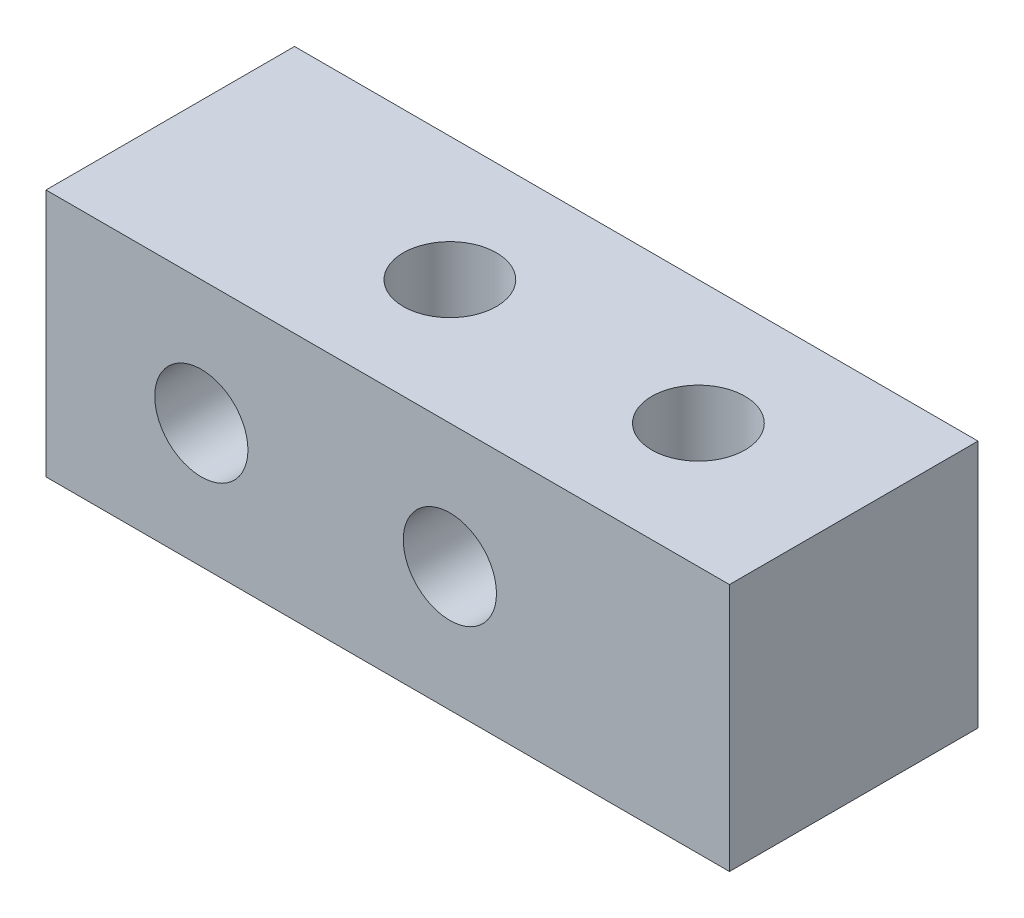
ISO-10303-21;
HEADER;
FILE_DESCRIPTION(('STEP AP214'),'2;1');
FILE_NAME('part.step','',(''),(''),'','','');
FILE_SCHEMA(('AUTOMOTIVE_DESIGN { 1 0 10303 214 1 1 1 1 }'));
ENDSEC;
DATA;
#1=APPLICATION_CONTEXT('core data for automotive mechanical design processes');
#2=APPLICATION_PROTOCOL_DEFINITION('international standard','automotive_design',2000,#1);
#3=PRODUCT_CONTEXT('',#1,'mechanical');
#4=PRODUCT('Part','Part','',(#3));
#5=PRODUCT_RELATED_PRODUCT_CATEGORY('part','',(#4));
#6=PRODUCT_DEFINITION_FORMATION('','',#4);
#7=PRODUCT_DEFINITION_CONTEXT('part definition',#1,'design');
#8=PRODUCT_DEFINITION('design','',#6,#7);
#9=PRODUCT_DEFINITION_SHAPE('','',#8);
#10=(LENGTH_UNIT() NAMED_UNIT(*) SI_UNIT(.MILLI.,.METRE.));
#11=(NAMED_UNIT(*) PLANE_ANGLE_UNIT() SI_UNIT($,.RADIAN.));
#12=(NAMED_UNIT(*) SI_UNIT($,.STERADIAN.) SOLID_ANGLE_UNIT());
#13=UNCERTAINTY_MEASURE_WITH_UNIT(LENGTH_MEASURE(1.E-05),#10,'distance_accuracy_value','');
#14=(GEOMETRIC_REPRESENTATION_CONTEXT(3) GLOBAL_UNCERTAINTY_ASSIGNED_CONTEXT((#13)) GLOBAL_UNIT_ASSIGNED_CONTEXT((#10,
#11,#12)) REPRESENTATION_CONTEXT('',''));
#15=CARTESIAN_POINT('',(0.,0.,0.));
#16=DIRECTION('',(0.,0.,1.));
#17=DIRECTION('',(1.,0.,0.));
#18=AXIS2_PLACEMENT_3D('',#15,#16,#17);
#19=CARTESIAN_POINT('',(0.,8.,0.));
#20=DIRECTION('',(1.,0.,0.));
#21=DIRECTION('',(0.,0.,-1.));
#22=AXIS2_PLACEMENT_3D('',#19,#20,#21);
#23=PLANE('',#22);
#24=DIRECTION('',(0.,0.,1.));
#25=VECTOR('',#24,1.);
#26=CARTESIAN_POINT('',(0.,0.,0.));
#27=LINE('',#26,#25);
#28=CARTESIAN_POINT('',(0.,0.,0.));
#29=VERTEX_POINT('',#28);
#30=CARTESIAN_POINT('',(0.,0.,8.));
#31=VERTEX_POINT('',#30);
#32=EDGE_CURVE('E113',#29,#31,#27,.T.);
#33=ORIENTED_EDGE('',*,*,#32,.T.);
#34=DIRECTION('',(0.,-1.,0.));
#35=VECTOR('',#34,1.);
#36=CARTESIAN_POINT('',(0.,8.,8.));
#37=LINE('',#36,#35);
#38=CARTESIAN_POINT('',(0.,8.,8.));
#39=VERTEX_POINT('',#38);
#40=EDGE_CURVE('E11',#39,#31,#37,.T.);
#41=ORIENTED_EDGE('',*,*,#40,.F.);
#42=DIRECTION('',(0.,0.,1.));
#43=VECTOR('',#42,1.);
#44=CARTESIAN_POINT('',(0.,8.,0.));
#45=LINE('',#44,#43);
#46=CARTESIAN_POINT('',(0.,8.,0.));
#47=VERTEX_POINT('',#46);
#48=EDGE_CURVE('E97',#47,#39,#45,.T.);
#49=ORIENTED_EDGE('',*,*,#48,.F.);
#50=DIRECTION('',(0.,-1.,0.));
#51=VECTOR('',#50,1.);
#52=CARTESIAN_POINT('',(0.,8.,0.));
#53=LINE('',#52,#51);
#54=EDGE_CURVE('E109',#47,#29,#53,.T.);
#55=ORIENTED_EDGE('',*,*,#54,.T.);
#56=EDGE_LOOP('',(#33,#41,#49,#55));
#57=FACE_BOUND('',#56,.T.);
#58=ADVANCED_FACE('F45',(#57),#23,.F.);
#59=CARTESIAN_POINT('',(0.,8.,8.));
#60=DIRECTION('',(0.,0.,-1.));
#61=DIRECTION('',(-1.,0.,0.));
#62=AXIS2_PLACEMENT_3D('',#59,#60,#61);
#63=PLANE('',#62);
#64=CARTESIAN_POINT('',(5.,4.,8.));
#65=DIRECTION('',(0.,0.,1.));
#66=DIRECTION('',(1.,0.,0.));
#67=AXIS2_PLACEMENT_3D('',#64,#65,#66);
#68=CIRCLE('',#67,1.5);
#69=CARTESIAN_POINT('',(6.5,4.,8.));
#70=VERTEX_POINT('',#69);
#71=EDGE_CURVE('E158',#70,#70,#68,.T.);
#72=ORIENTED_EDGE('',*,*,#71,.F.);
#73=EDGE_LOOP('',(#72));
#74=FACE_BOUND('',#73,.T.);
#75=CARTESIAN_POINT('',(13.,4.,8.));
#76=DIRECTION('',(0.,0.,1.));
#77=DIRECTION('',(1.,0.,0.));
#78=AXIS2_PLACEMENT_3D('',#75,#76,#77);
#79=CIRCLE('',#78,1.5);
#80=CARTESIAN_POINT('',(14.5,4.,8.));
#81=VERTEX_POINT('',#80);
#82=EDGE_CURVE('E154',#81,#81,#79,.T.);
#83=ORIENTED_EDGE('',*,*,#82,.F.);
#84=EDGE_LOOP('',(#83));
#85=FACE_BOUND('',#84,.T.);
#86=DIRECTION('',(1.,0.,0.));
#87=VECTOR('',#86,1.);
#88=CARTESIAN_POINT('',(0.,0.,8.));
#89=LINE('',#88,#87);
#90=CARTESIAN_POINT('',(22.,0.,8.));
#91=VERTEX_POINT('',#90);
#92=EDGE_CURVE('E102',#31,#91,#89,.T.);
#93=ORIENTED_EDGE('',*,*,#92,.T.);
#94=DIRECTION('',(0.,-1.,0.));
#95=VECTOR('',#94,1.);
#96=CARTESIAN_POINT('',(22.,8.,8.));
#97=LINE('',#96,#95);
#98=CARTESIAN_POINT('',(22.,8.,8.));
#99=VERTEX_POINT('',#98);
#100=EDGE_CURVE('E54',#99,#91,#97,.T.);
#101=ORIENTED_EDGE('',*,*,#100,.F.);
#102=DIRECTION('',(1.,0.,0.));
#103=VECTOR('',#102,1.);
#104=CARTESIAN_POINT('',(0.,8.,8.));
#105=LINE('',#104,#103);
#106=EDGE_CURVE('E92',#39,#99,#105,.T.);
#107=ORIENTED_EDGE('',*,*,#106,.F.);
#108=ORIENTED_EDGE('',*,*,#40,.T.);
#109=EDGE_LOOP('',(#93,#101,#107,#108));
#110=FACE_BOUND('',#109,.T.);
#111=ADVANCED_FACE('F101',(#74,#85,#110),#63,.F.);
#112=CARTESIAN_POINT('',(22.,8.,0.));
#113=DIRECTION('',(-1.,0.,0.));
#114=DIRECTION('',(0.,0.,1.));
#115=AXIS2_PLACEMENT_3D('',#112,#113,#114);
#116=PLANE('',#115);
#117=DIRECTION('',(0.,0.,-1.));
#118=VECTOR('',#117,1.);
#119=CARTESIAN_POINT('',(22.,0.,0.));
#120=LINE('',#119,#118);
#121=CARTESIAN_POINT('',(22.,0.,0.));
#122=VERTEX_POINT('',#121);
#123=EDGE_CURVE('E79',#91,#122,#120,.T.);
#124=ORIENTED_EDGE('',*,*,#123,.T.);
#125=DIRECTION('',(0.,-1.,0.));
#126=VECTOR('',#125,1.);
#127=CARTESIAN_POINT('',(22.,8.,0.));
#128=LINE('',#127,#126);
#129=CARTESIAN_POINT('',(22.,8.,0.));
#130=VERTEX_POINT('',#129);
#131=EDGE_CURVE('E104',#130,#122,#128,.T.);
#132=ORIENTED_EDGE('',*,*,#131,.F.);
#133=DIRECTION('',(0.,0.,-1.));
#134=VECTOR('',#133,1.);
#135=CARTESIAN_POINT('',(22.,8.,0.));
#136=LINE('',#135,#134);
#137=EDGE_CURVE('E95',#99,#130,#136,.T.);
#138=ORIENTED_EDGE('',*,*,#137,.F.);
#139=ORIENTED_EDGE('',*,*,#100,.T.);
#140=EDGE_LOOP('',(#124,#132,#138,#139));
#141=FACE_BOUND('',#140,.T.);
#142=ADVANCED_FACE('F105',(#141),#116,.F.);
#143=CARTESIAN_POINT('',(0.,8.,0.));
#144=DIRECTION('',(0.,0.,1.));
#145=DIRECTION('',(1.,0.,0.));
#146=AXIS2_PLACEMENT_3D('',#143,#144,#145);
#147=PLANE('',#146);
#148=CARTESIAN_POINT('',(5.,4.,0.));
#149=DIRECTION('',(0.,0.,1.));
#150=DIRECTION('',(1.,0.,0.));
#151=AXIS2_PLACEMENT_3D('',#148,#149,#150);
#152=CIRCLE('',#151,1.5);
#153=CARTESIAN_POINT('',(6.5,4.,0.));
#154=VERTEX_POINT('',#153);
#155=EDGE_CURVE('E139',#154,#154,#152,.T.);
#156=ORIENTED_EDGE('',*,*,#155,.T.);
#157=EDGE_LOOP('',(#156));
#158=FACE_BOUND('',#157,.T.);
#159=CARTESIAN_POINT('',(13.,4.,0.));
#160=DIRECTION('',(0.,0.,1.));
#161=DIRECTION('',(1.,0.,0.));
#162=AXIS2_PLACEMENT_3D('',#159,#160,#161);
#163=CIRCLE('',#162,1.5);
#164=CARTESIAN_POINT('',(14.5,4.,0.));
#165=VERTEX_POINT('',#164);
#166=EDGE_CURVE('E150',#165,#165,#163,.T.);
#167=ORIENTED_EDGE('',*,*,#166,.T.);
#168=EDGE_LOOP('',(#167));
#169=FACE_BOUND('',#168,.T.);
#170=DIRECTION('',(-1.,0.,0.));
#171=VECTOR('',#170,1.);
#172=CARTESIAN_POINT('',(0.,0.,0.));
#173=LINE('',#172,#171);
#174=EDGE_CURVE('E85',#122,#29,#173,.T.);
#175=ORIENTED_EDGE('',*,*,#174,.T.);
#176=ORIENTED_EDGE('',*,*,#54,.F.);
#177=DIRECTION('',(-1.,0.,0.));
#178=VECTOR('',#177,1.);
#179=CARTESIAN_POINT('',(0.,8.,0.));
#180=LINE('',#179,#178);
#181=EDGE_CURVE('E62',#130,#47,#180,.T.);
#182=ORIENTED_EDGE('',*,*,#181,.F.);
#183=ORIENTED_EDGE('',*,*,#131,.T.);
#184=EDGE_LOOP('',(#175,#176,#182,#183));
#185=FACE_BOUND('',#184,.T.);
#186=ADVANCED_FACE('F127',(#158,#169,#185),#147,.F.);
#187=CARTESIAN_POINT('',(0.,8.,0.));
#188=DIRECTION('',(0.,1.,0.));
#189=DIRECTION('',(0.,0.,1.));
#190=AXIS2_PLACEMENT_3D('',#187,#188,#189);
#191=PLANE('',#190);
#192=CARTESIAN_POINT('',(17.,8.,4.));
#193=DIRECTION('',(0.,1.,0.));
#194=DIRECTION('',(0.,0.,1.));
#195=AXIS2_PLACEMENT_3D('',#192,#193,#194);
#196=CIRCLE('',#195,1.5);
#197=CARTESIAN_POINT('',(17.,8.,5.5));
#198=VERTEX_POINT('',#197);
#199=EDGE_CURVE('E143',#198,#198,#196,.T.);
#200=ORIENTED_EDGE('',*,*,#199,.F.);
#201=EDGE_LOOP('',(#200));
#202=FACE_BOUND('',#201,.T.);
#203=CARTESIAN_POINT('',(9.,8.,4.));
#204=DIRECTION('',(0.,1.,0.));
#205=DIRECTION('',(0.,0.,1.));
#206=AXIS2_PLACEMENT_3D('',#203,#204,#205);
#207=CIRCLE('',#206,1.5);
#208=CARTESIAN_POINT('',(9.,8.,5.5));
#209=VERTEX_POINT('',#208);
#210=EDGE_CURVE('E138',#209,#209,#207,.T.);
#211=ORIENTED_EDGE('',*,*,#210,.F.);
#212=EDGE_LOOP('',(#211));
#213=FACE_BOUND('',#212,.T.);
#214=ORIENTED_EDGE('',*,*,#48,.T.);
#215=ORIENTED_EDGE('',*,*,#106,.T.);
#216=ORIENTED_EDGE('',*,*,#137,.T.);
#217=ORIENTED_EDGE('',*,*,#181,.T.);
#218=EDGE_LOOP('',(#214,#215,#216,#217));
#219=FACE_BOUND('',#218,.T.);
#220=ADVANCED_FACE('F93',(#202,#213,#219),#191,.T.);
#221=CARTESIAN_POINT('',(0.,0.,0.));
#222=DIRECTION('',(0.,1.,0.));
#223=DIRECTION('',(0.,0.,1.));
#224=AXIS2_PLACEMENT_3D('',#221,#222,#223);
#225=PLANE('',#224);
#226=CARTESIAN_POINT('',(17.,0.,4.));
#227=DIRECTION('',(0.,1.,0.));
#228=DIRECTION('',(0.,0.,1.));
#229=AXIS2_PLACEMENT_3D('',#226,#227,#228);
#230=CIRCLE('',#229,1.5);
#231=CARTESIAN_POINT('',(17.,0.,5.5));
#232=VERTEX_POINT('',#231);
#233=EDGE_CURVE('E117',#232,#232,#230,.T.);
#234=ORIENTED_EDGE('',*,*,#233,.T.);
#235=EDGE_LOOP('',(#234));
#236=FACE_BOUND('',#235,.T.);
#237=CARTESIAN_POINT('',(9.,0.,4.));
#238=DIRECTION('',(0.,1.,0.));
#239=DIRECTION('',(0.,0.,1.));
#240=AXIS2_PLACEMENT_3D('',#237,#238,#239);
#241=CIRCLE('',#240,1.5);
#242=CARTESIAN_POINT('',(9.,0.,5.5));
#243=VERTEX_POINT('',#242);
#244=EDGE_CURVE('E134',#243,#243,#241,.T.);
#245=ORIENTED_EDGE('',*,*,#244,.T.);
#246=EDGE_LOOP('',(#245));
#247=FACE_BOUND('',#246,.T.);
#248=ORIENTED_EDGE('',*,*,#32,.F.);
#249=ORIENTED_EDGE('',*,*,#174,.F.);
#250=ORIENTED_EDGE('',*,*,#123,.F.);
#251=ORIENTED_EDGE('',*,*,#92,.F.);
#252=EDGE_LOOP('',(#248,#249,#250,#251));
#253=FACE_BOUND('',#252,.T.);
#254=ADVANCED_FACE('F130',(#236,#247,#253),#225,.F.);
#255=CARTESIAN_POINT('',(9.,0.,4.));
#256=DIRECTION('',(0.,1.,0.));
#257=DIRECTION('',(0.,0.,1.));
#258=AXIS2_PLACEMENT_3D('',#255,#256,#257);
#259=CYLINDRICAL_SURFACE('',#258,1.5);
#260=ORIENTED_EDGE('',*,*,#244,.F.);
#261=EDGE_LOOP('',(#260));
#262=FACE_BOUND('',#261,.T.);
#263=ORIENTED_EDGE('',*,*,#210,.T.);
#264=EDGE_LOOP('',(#263));
#265=FACE_BOUND('',#264,.T.);
#266=ADVANCED_FACE('F187',(#262,#265),#259,.F.);
#267=CARTESIAN_POINT('',(17.,0.,4.));
#268=DIRECTION('',(0.,1.,0.));
#269=DIRECTION('',(0.,0.,1.));
#270=AXIS2_PLACEMENT_3D('',#267,#268,#269);
#271=CYLINDRICAL_SURFACE('',#270,1.5);
#272=ORIENTED_EDGE('',*,*,#233,.F.);
#273=EDGE_LOOP('',(#272));
#274=FACE_BOUND('',#273,.T.);
#275=ORIENTED_EDGE('',*,*,#199,.T.);
#276=EDGE_LOOP('',(#275));
#277=FACE_BOUND('',#276,.T.);
#278=ADVANCED_FACE('F180',(#274,#277),#271,.F.);
#279=CARTESIAN_POINT('',(13.,4.,0.));
#280=DIRECTION('',(0.,0.,1.));
#281=DIRECTION('',(1.,0.,0.));
#282=AXIS2_PLACEMENT_3D('',#279,#280,#281);
#283=CYLINDRICAL_SURFACE('',#282,1.5);
#284=ORIENTED_EDGE('',*,*,#166,.F.);
#285=EDGE_LOOP('',(#284));
#286=FACE_BOUND('',#285,.T.);
#287=ORIENTED_EDGE('',*,*,#82,.T.);
#288=EDGE_LOOP('',(#287));
#289=FACE_BOUND('',#288,.T.);
#290=ADVANCED_FACE('F171',(#286,#289),#283,.F.);
#291=CARTESIAN_POINT('',(5.,4.,0.));
#292=DIRECTION('',(0.,0.,1.));
#293=DIRECTION('',(1.,0.,0.));
#294=AXIS2_PLACEMENT_3D('',#291,#292,#293);
#295=CYLINDRICAL_SURFACE('',#294,1.5);
#296=ORIENTED_EDGE('',*,*,#155,.F.);
#297=EDGE_LOOP('',(#296));
#298=FACE_BOUND('',#297,.T.);
#299=ORIENTED_EDGE('',*,*,#71,.T.);
#300=EDGE_LOOP('',(#299));
#301=FACE_BOUND('',#300,.T.);
#302=ADVANCED_FACE('F168',(#298,#301),#295,.F.);
#303=CLOSED_SHELL('',(#58,#111,#142,#186,#220,#254,#266,#278,#290,#302));
#304=MANIFOLD_SOLID_BREP('B2',#303);
#305=ADVANCED_BREP_SHAPE_REPRESENTATION('',(#18,#304),#14);
#306=SHAPE_DEFINITION_REPRESENTATION(#9,#305);
ENDSEC;
END-ISO-10303-21;
